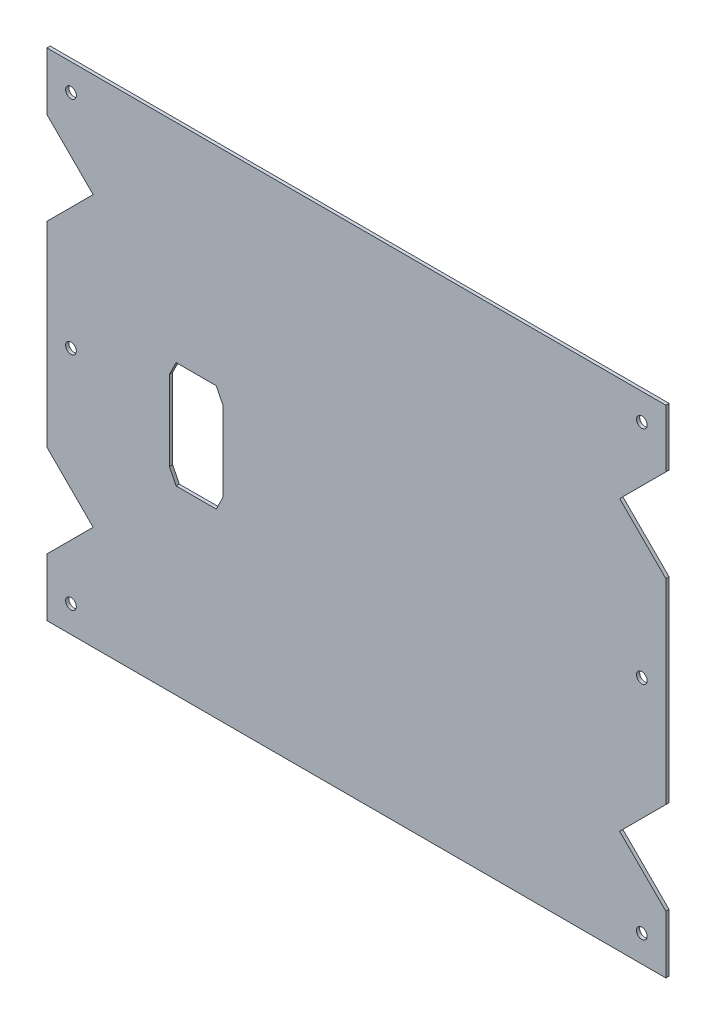
ISO-10303-21;
HEADER;
FILE_DESCRIPTION(('STEP AP214'),'2;1');
FILE_NAME('part.step','',(''),(''),'','','');
FILE_SCHEMA(('AUTOMOTIVE_DESIGN { 1 0 10303 214 1 1 1 1 }'));
ENDSEC;
DATA;
#1=APPLICATION_CONTEXT('core data for automotive mechanical design processes');
#2=APPLICATION_PROTOCOL_DEFINITION('international standard','automotive_design',2000,#1);
#3=PRODUCT_CONTEXT('',#1,'mechanical');
#4=PRODUCT('Part','Part','',(#3));
#5=PRODUCT_RELATED_PRODUCT_CATEGORY('part','',(#4));
#6=PRODUCT_DEFINITION_FORMATION('','',#4);
#7=PRODUCT_DEFINITION_CONTEXT('part definition',#1,'design');
#8=PRODUCT_DEFINITION('design','',#6,#7);
#9=PRODUCT_DEFINITION_SHAPE('','',#8);
#10=(LENGTH_UNIT() NAMED_UNIT(*) SI_UNIT(.MILLI.,.METRE.));
#11=(NAMED_UNIT(*) PLANE_ANGLE_UNIT() SI_UNIT($,.RADIAN.));
#12=(NAMED_UNIT(*) SI_UNIT($,.STERADIAN.) SOLID_ANGLE_UNIT());
#13=UNCERTAINTY_MEASURE_WITH_UNIT(LENGTH_MEASURE(1.E-05),#10,'distance_accuracy_value','');
#14=(GEOMETRIC_REPRESENTATION_CONTEXT(3) GLOBAL_UNCERTAINTY_ASSIGNED_CONTEXT((#13)) GLOBAL_UNIT_ASSIGNED_CONTEXT((#10,
#11,#12)) REPRESENTATION_CONTEXT('',''));
#15=CARTESIAN_POINT('',(0.,0.,0.));
#16=DIRECTION('',(0.,0.,1.));
#17=DIRECTION('',(1.,0.,0.));
#18=AXIS2_PLACEMENT_3D('',#15,#16,#17);
#19=CARTESIAN_POINT('',(0.,0.,-1.2));
#20=DIRECTION('',(0.,0.,-1.));
#21=DIRECTION('',(-1.,0.,0.));
#22=AXIS2_PLACEMENT_3D('',#19,#20,#21);
#23=PLANE('',#22);
#24=DIRECTION('',(0.707106781186546,0.707106781186549,0.));
#25=VECTOR('',#24,1.);
#26=CARTESIAN_POINT('',(-52.7102576685097,54.8232233047031,-1.19999999999962));
#27=LINE('',#26,#25);
#28=CARTESIAN_POINT('',(-15.8870343638064,91.6464466094066,-1.19999999999989));
#29=VERTEX_POINT('',#28);
#30=CARTESIAN_POINT('',(1.41003620869003,108.943517181903,-1.20000000000002));
#31=VERTEX_POINT('',#30);
#32=EDGE_CURVE('E859',#29,#31,#27,.T.);
#33=ORIENTED_EDGE('',*,*,#32,.T.);
#34=DIRECTION('',(-0.707106781186545,0.70710678118655,0.));
#35=VECTOR('',#34,1.);
#36=CARTESIAN_POINT('',(-52.7102576685094,163.063811059103,-1.19999999999937));
#37=LINE('',#36,#35);
#38=CARTESIAN_POINT('',(-15.8870343638065,126.2405877544,-1.19999999999977));
#39=VERTEX_POINT('',#38);
#40=EDGE_CURVE('E743',#31,#39,#37,.T.);
#41=ORIENTED_EDGE('',*,*,#40,.T.);
#42=DIRECTION('',(0.,1.,0.));
#43=VECTOR('',#42,1.);
#44=CARTESIAN_POINT('',(-15.8870343638065,109.823634363806,-1.19999999999981));
#45=LINE('',#44,#43);
#46=CARTESIAN_POINT('',(-15.8870343638064,147.887034363806,-1.19999999999967));
#47=VERTEX_POINT('',#46);
#48=EDGE_CURVE('E760',#47,#39,#45,.F.);
#49=ORIENTED_EDGE('',*,*,#48,.F.);
#50=DIRECTION('',(1.,0.,0.));
#51=VECTOR('',#50,1.);
#52=CARTESIAN_POINT('',(199.087034363806,147.887034363806,-1.19999999999978));
#53=LINE('',#52,#51);
#54=CARTESIAN_POINT('',(215.887034363806,147.887034363806,-1.19999999999967));
#55=VERTEX_POINT('',#54);
#56=EDGE_CURVE('E772',#55,#47,#53,.F.);
#57=ORIENTED_EDGE('',*,*,#56,.F.);
#58=DIRECTION('',(0.,-1.,0.));
#59=VECTOR('',#58,1.);
#60=CARTESIAN_POINT('',(215.887034363806,147.887034363806,-1.19999999999967));
#61=LINE('',#60,#59);
#62=CARTESIAN_POINT('',(215.887034363806,126.2405877544,-1.19999999999974));
#63=VERTEX_POINT('',#62);
#64=EDGE_CURVE('E770',#63,#55,#61,.F.);
#65=ORIENTED_EDGE('',*,*,#64,.F.);
#66=DIRECTION('',(-0.707106781186544,-0.707106781186551,0.));
#67=VECTOR('',#66,1.);
#68=CARTESIAN_POINT('',(252.710257668509,163.063811059103,-1.19999999999937));
#69=LINE('',#68,#67);
#70=CARTESIAN_POINT('',(198.58996379131,108.943517181903,-1.19999999999991));
#71=VERTEX_POINT('',#70);
#72=EDGE_CURVE('E749',#63,#71,#69,.T.);
#73=ORIENTED_EDGE('',*,*,#72,.T.);
#74=DIRECTION('',(0.707106781186546,-0.707106781186549,0.));
#75=VECTOR('',#74,1.);
#76=CARTESIAN_POINT('',(252.710257668509,54.8232233047035,-1.19999999999962));
#77=LINE('',#76,#75);
#78=CARTESIAN_POINT('',(215.887034363806,91.6464466094066,-1.1999999999999));
#79=VERTEX_POINT('',#78);
#80=EDGE_CURVE('E725',#71,#79,#77,.T.);
#81=ORIENTED_EDGE('',*,*,#80,.T.);
#82=DIRECTION('',(0.,-1.,0.));
#83=VECTOR('',#82,1.);
#84=CARTESIAN_POINT('',(215.887034363806,108.0634,-1.19999999999992));
#85=LINE('',#84,#83);
#86=CARTESIAN_POINT('',(215.887034363806,18.3535533905934,-1.19999999999987));
#87=VERTEX_POINT('',#86);
#88=EDGE_CURVE('E781',#87,#79,#85,.F.);
#89=ORIENTED_EDGE('',*,*,#88,.F.);
#90=DIRECTION('',(-0.707106781186546,-0.707106781186549,0.));
#91=VECTOR('',#90,1.);
#92=CARTESIAN_POINT('',(197.710257668509,0.176776695296352,-1.19999999999998));
#93=LINE('',#92,#91);
#94=CARTESIAN_POINT('',(198.58996379131,1.05648281809682,-1.19999999999997));
#95=VERTEX_POINT('',#94);
#96=EDGE_CURVE('E720',#87,#95,#93,.T.);
#97=ORIENTED_EDGE('',*,*,#96,.T.);
#98=DIRECTION('',(0.707106781186546,-0.707106781186549,0.));
#99=VECTOR('',#98,1.);
#100=CARTESIAN_POINT('',(197.710257668509,1.93618894089735,-1.20000000000003));
#101=LINE('',#100,#99);
#102=CARTESIAN_POINT('',(215.887034363806,-16.2405877543997,-1.1999999999998));
#103=VERTEX_POINT('',#102);
#104=EDGE_CURVE('E794',#95,#103,#101,.T.);
#105=ORIENTED_EDGE('',*,*,#104,.T.);
#106=DIRECTION('',(0.,-1.,0.));
#107=VECTOR('',#106,1.);
#108=CARTESIAN_POINT('',(215.887034363806,0.176365636193668,-1.19999999999991));
#109=LINE('',#108,#107);
#110=CARTESIAN_POINT('',(215.887034363806,-37.8870343638063,-1.19999999999964));
#111=VERTEX_POINT('',#110);
#112=EDGE_CURVE('E803',#111,#103,#109,.F.);
#113=ORIENTED_EDGE('',*,*,#112,.F.);
#114=DIRECTION('',(-1.,0.,0.));
#115=VECTOR('',#114,1.);
#116=CARTESIAN_POINT('',(215.887034363806,-37.8870343638063,-1.19999999999964));
#117=LINE('',#116,#115);
#118=CARTESIAN_POINT('',(-15.8870343638064,-37.8870343638064,-1.19999999999967));
#119=VERTEX_POINT('',#118);
#120=EDGE_CURVE('E822',#119,#111,#117,.F.);
#121=ORIENTED_EDGE('',*,*,#120,.F.);
#122=DIRECTION('',(0.,1.,0.));
#123=VECTOR('',#122,1.);
#124=CARTESIAN_POINT('',(-15.8870343638064,-37.8870343638064,-1.19999999999967));
#125=LINE('',#124,#123);
#126=CARTESIAN_POINT('',(-15.8870343638064,-16.2405877543997,-1.1999999999998));
#127=VERTEX_POINT('',#126);
#128=EDGE_CURVE('E816',#127,#119,#125,.F.);
#129=ORIENTED_EDGE('',*,*,#128,.F.);
#130=DIRECTION('',(0.707106781186547,0.707106781186548,0.));
#131=VECTOR('',#130,1.);
#132=CARTESIAN_POINT('',(2.28974233149026,1.93618894089697,-1.20000000000004));
#133=LINE('',#132,#131);
#134=CARTESIAN_POINT('',(1.41003620869012,1.05648281809682,-1.20000000000003));
#135=VERTEX_POINT('',#134);
#136=EDGE_CURVE('E789',#127,#135,#133,.T.);
#137=ORIENTED_EDGE('',*,*,#136,.T.);
#138=DIRECTION('',(-0.707106781186546,0.707106781186549,0.));
#139=VECTOR('',#138,1.);
#140=CARTESIAN_POINT('',(2.28974233149028,0.176776695296656,-1.19999999999999));
#141=LINE('',#140,#139);
#142=CARTESIAN_POINT('',(-15.8870343638064,18.3535533905934,-1.19999999999988));
#143=VERTEX_POINT('',#142);
#144=EDGE_CURVE('E861',#135,#143,#141,.T.);
#145=ORIENTED_EDGE('',*,*,#144,.T.);
#146=DIRECTION('',(0.,1.,0.));
#147=VECTOR('',#146,1.);
#148=CARTESIAN_POINT('',(-15.8870343638064,1.93659999999999,-1.19999999999987));
#149=LINE('',#148,#147);
#150=EDGE_CURVE('E828',#29,#143,#149,.F.);
#151=ORIENTED_EDGE('',*,*,#150,.F.);
#152=EDGE_LOOP('',(#33,#41,#49,#57,#65,#73,#81,#89,#97,#105,#113,#121,#129,#137,#145,#151));
#153=FACE_BOUND('',#152,.T.);
#154=DIRECTION('',(0.447213595499958,-0.894427190999916,0.));
#155=VECTOR('',#154,1.);
#156=CARTESIAN_POINT('',(66.,33.,-1.2));
#157=LINE('',#156,#155);
#158=CARTESIAN_POINT('',(47.5,70.,-1.2));
#159=VERTEX_POINT('',#158);
#160=CARTESIAN_POINT('',(50.,65.,-1.2));
#161=VERTEX_POINT('',#160);
#162=EDGE_CURVE('E13',#159,#161,#157,.T.);
#163=ORIENTED_EDGE('',*,*,#162,.F.);
#164=DIRECTION('',(1.,0.,0.));
#165=VECTOR('',#164,1.);
#166=CARTESIAN_POINT('',(0.,70.,-1.2));
#167=LINE('',#166,#165);
#168=CARTESIAN_POINT('',(32.5,70.,-1.2));
#169=VERTEX_POINT('',#168);
#170=EDGE_CURVE('E893',#169,#159,#167,.T.);
#171=ORIENTED_EDGE('',*,*,#170,.F.);
#172=DIRECTION('',(0.447213595499957,0.894427190999917,0.));
#173=VECTOR('',#172,1.);
#174=CARTESIAN_POINT('',(-1.99999999999995,0.999999999999971,-1.2));
#175=LINE('',#174,#173);
#176=CARTESIAN_POINT('',(30.,65.,-1.2));
#177=VERTEX_POINT('',#176);
#178=EDGE_CURVE('E907',#177,#169,#175,.T.);
#179=ORIENTED_EDGE('',*,*,#178,.F.);
#180=DIRECTION('',(0.,1.,0.));
#181=VECTOR('',#180,1.);
#182=CARTESIAN_POINT('',(30.,0.,-1.2));
#183=LINE('',#182,#181);
#184=CARTESIAN_POINT('',(30.,35.,-1.2));
#185=VERTEX_POINT('',#184);
#186=EDGE_CURVE('E909',#185,#177,#183,.T.);
#187=ORIENTED_EDGE('',*,*,#186,.F.);
#188=DIRECTION('',(-0.447213595499958,0.894427190999916,0.));
#189=VECTOR('',#188,1.);
#190=CARTESIAN_POINT('',(38.,19.,-1.2));
#191=LINE('',#190,#189);
#192=CARTESIAN_POINT('',(32.5,30.,-1.2));
#193=VERTEX_POINT('',#192);
#194=EDGE_CURVE('E911',#193,#185,#191,.T.);
#195=ORIENTED_EDGE('',*,*,#194,.F.);
#196=DIRECTION('',(-1.,0.,0.));
#197=VECTOR('',#196,1.);
#198=CARTESIAN_POINT('',(0.,30.,-1.2));
#199=LINE('',#198,#197);
#200=CARTESIAN_POINT('',(47.5,30.,-1.2));
#201=VERTEX_POINT('',#200);
#202=EDGE_CURVE('E913',#201,#193,#199,.T.);
#203=ORIENTED_EDGE('',*,*,#202,.F.);
#204=DIRECTION('',(-0.447213595499958,-0.894427190999916,0.));
#205=VECTOR('',#204,1.);
#206=CARTESIAN_POINT('',(26.,-13.,-1.2));
#207=LINE('',#206,#205);
#208=CARTESIAN_POINT('',(50.,35.,-1.2));
#209=VERTEX_POINT('',#208);
#210=EDGE_CURVE('E915',#209,#201,#207,.T.);
#211=ORIENTED_EDGE('',*,*,#210,.F.);
#212=DIRECTION('',(0.,-1.,0.));
#213=VECTOR('',#212,1.);
#214=CARTESIAN_POINT('',(50.,0.,-1.2));
#215=LINE('',#214,#213);
#216=EDGE_CURVE('E547',#161,#209,#215,.T.);
#217=ORIENTED_EDGE('',*,*,#216,.F.);
#218=EDGE_LOOP('',(#163,#171,#179,#187,#195,#203,#211,#217));
#219=FACE_BOUND('',#218,.T.);
#220=CARTESIAN_POINT('',(-6.88703436380638,55.,-1.19999999999996));
#221=DIRECTION('',(0.,0.,-1.));
#222=DIRECTION('',(-1.,0.,0.));
#223=AXIS2_PLACEMENT_3D('',#220,#221,#222);
#224=CIRCLE('',#223,2.);
#225=CARTESIAN_POINT('',(-8.88703436380638,55.,-1.19999999999995));
#226=VERTEX_POINT('',#225);
#227=EDGE_CURVE('E864',#226,#226,#224,.F.);
#228=ORIENTED_EDGE('',*,*,#227,.T.);
#229=EDGE_LOOP('',(#228));
#230=FACE_BOUND('',#229,.T.);
#231=CARTESIAN_POINT('',(206.887034363806,55.,-1.19999999999992));
#232=DIRECTION('',(0.,0.,-1.));
#233=DIRECTION('',(-1.,0.,0.));
#234=AXIS2_PLACEMENT_3D('',#231,#232,#233);
#235=CIRCLE('',#234,2.);
#236=CARTESIAN_POINT('',(204.887034363806,55.,-1.19999999999994));
#237=VERTEX_POINT('',#236);
#238=EDGE_CURVE('E836',#237,#237,#235,.F.);
#239=ORIENTED_EDGE('',*,*,#238,.T.);
#240=EDGE_LOOP('',(#239));
#241=FACE_BOUND('',#240,.T.);
#242=CARTESIAN_POINT('',(-6.88703436380642,-27.8870343638064,-1.19999999999978));
#243=DIRECTION('',(0.,0.,-1.));
#244=DIRECTION('',(-1.,0.,0.));
#245=AXIS2_PLACEMENT_3D('',#242,#243,#244);
#246=CIRCLE('',#245,2.);
#247=CARTESIAN_POINT('',(-8.88703436380643,-27.8870343638064,-1.19999999999977));
#248=VERTEX_POINT('',#247);
#249=EDGE_CURVE('E791',#248,#248,#246,.F.);
#250=ORIENTED_EDGE('',*,*,#249,.T.);
#251=EDGE_LOOP('',(#250));
#252=FACE_BOUND('',#251,.T.);
#253=CARTESIAN_POINT('',(206.887034363806,-27.8870343638064,-1.19999999999976));
#254=DIRECTION('',(0.,0.,-1.));
#255=DIRECTION('',(-1.,0.,0.));
#256=AXIS2_PLACEMENT_3D('',#253,#254,#255);
#257=CIRCLE('',#256,2.);
#258=CARTESIAN_POINT('',(204.887034363806,-27.8870343638064,-1.19999999999977));
#259=VERTEX_POINT('',#258);
#260=EDGE_CURVE('E797',#259,#259,#257,.F.);
#261=ORIENTED_EDGE('',*,*,#260,.T.);
#262=EDGE_LOOP('',(#261));
#263=FACE_BOUND('',#262,.T.);
#264=CARTESIAN_POINT('',(-6.88703436380644,137.887034363806,-1.19999999999978));
#265=DIRECTION('',(0.,0.,-1.));
#266=DIRECTION('',(1.,0.,0.));
#267=AXIS2_PLACEMENT_3D('',#264,#265,#266);
#268=CIRCLE('',#267,2.);
#269=CARTESIAN_POINT('',(-4.88703436380644,137.887034363806,-1.1999999999998));
#270=VERTEX_POINT('',#269);
#271=EDGE_CURVE('E746',#270,#270,#268,.F.);
#272=ORIENTED_EDGE('',*,*,#271,.T.);
#273=EDGE_LOOP('',(#272));
#274=FACE_BOUND('',#273,.T.);
#275=CARTESIAN_POINT('',(206.887034363806,137.887034363806,-1.19999999999976));
#276=DIRECTION('',(0.,0.,-1.));
#277=DIRECTION('',(1.,0.,0.));
#278=AXIS2_PLACEMENT_3D('',#275,#276,#277);
#279=CIRCLE('',#278,2.);
#280=CARTESIAN_POINT('',(208.887034363806,137.887034363806,-1.19999999999974));
#281=VERTEX_POINT('',#280);
#282=EDGE_CURVE('E751',#281,#281,#279,.F.);
#283=ORIENTED_EDGE('',*,*,#282,.T.);
#284=EDGE_LOOP('',(#283));
#285=FACE_BOUND('',#284,.T.);
#286=ADVANCED_FACE('F539',(#153,#219,#230,#241,#252,#263,#274,#285),#23,.T.);
#287=CARTESIAN_POINT('',(0.,0.,0.));
#288=DIRECTION('',(0.,0.,-1.));
#289=DIRECTION('',(-1.,0.,0.));
#290=AXIS2_PLACEMENT_3D('',#287,#288,#289);
#291=PLANE('',#290);
#292=DIRECTION('',(-0.707106781186545,0.70710678118655,0.));
#293=VECTOR('',#292,1.);
#294=CARTESIAN_POINT('',(0.17636563619354,110.1771877544,0.));
#295=LINE('',#294,#293);
#296=CARTESIAN_POINT('',(1.41003620869004,108.943517181903,0.));
#297=VERTEX_POINT('',#296);
#298=CARTESIAN_POINT('',(-15.8870343638065,126.2405877544,2.63677968348475E-13));
#299=VERTEX_POINT('',#298);
#300=EDGE_CURVE('E709',#297,#299,#295,.T.);
#301=ORIENTED_EDGE('',*,*,#300,.F.);
#302=DIRECTION('',(0.707106781186546,0.707106781186549,0.));
#303=VECTOR('',#302,1.);
#304=CARTESIAN_POINT('',(-75.2318054658451,32.3016755073676,5.32157219339853E-13));
#305=LINE('',#304,#303);
#306=CARTESIAN_POINT('',(-15.8870343638064,91.6464466094066,1.08852103899871E-13));
#307=VERTEX_POINT('',#306);
#308=EDGE_CURVE('E844',#307,#297,#305,.T.);
#309=ORIENTED_EDGE('',*,*,#308,.F.);
#310=DIRECTION('',(0.,-1.,0.));
#311=VECTOR('',#310,1.);
#312=CARTESIAN_POINT('',(-15.8870343638064,0.,1.31981700798769E-13));
#313=LINE('',#312,#311);
#314=CARTESIAN_POINT('',(-15.8870343638064,18.3535533905934,1.28651534041364E-13));
#315=VERTEX_POINT('',#314);
#316=EDGE_CURVE('E849',#307,#315,#313,.T.);
#317=ORIENTED_EDGE('',*,*,#316,.T.);
#318=DIRECTION('',(-0.707106781186546,0.707106781186549,0.));
#319=VECTOR('',#318,1.);
#320=CARTESIAN_POINT('',(0.176365636193652,2.2901533905933,0.));
#321=LINE('',#320,#319);
#322=CARTESIAN_POINT('',(1.41003620869013,1.05648281809683,0.));
#323=VERTEX_POINT('',#322);
#324=EDGE_CURVE('E857',#323,#315,#321,.T.);
#325=ORIENTED_EDGE('',*,*,#324,.F.);
#326=DIRECTION('',(0.707106781186547,0.707106781186548,0.));
#327=VECTOR('',#326,1.);
#328=CARTESIAN_POINT('',(-28.8193698335697,-29.1729232241631,3.65762592959217E-13));
#329=LINE('',#328,#327);
#330=CARTESIAN_POINT('',(-15.8870343638064,-16.2405877543997,1.9795699455924E-13));
#331=VERTEX_POINT('',#330);
#332=EDGE_CURVE('E784',#331,#323,#329,.T.);
#333=ORIENTED_EDGE('',*,*,#332,.F.);
#334=DIRECTION('',(0.,-1.,0.));
#335=VECTOR('',#334,1.);
#336=CARTESIAN_POINT('',(-15.8870343638064,2.11296563619365,0.));
#337=LINE('',#336,#335);
#338=CARTESIAN_POINT('',(-15.8870343638064,-37.8870343638064,3.30443354406211E-13));
#339=VERTEX_POINT('',#338);
#340=EDGE_CURVE('E811',#331,#339,#337,.T.);
#341=ORIENTED_EDGE('',*,*,#340,.T.);
#342=DIRECTION('',(1.,0.,0.));
#343=VECTOR('',#342,1.);
#344=CARTESIAN_POINT('',(2.11296563619357,-37.8870343638064,2.07399447753438E-13));
#345=LINE('',#344,#343);
#346=CARTESIAN_POINT('',(215.887034363806,-37.8870343638063,3.68760480071351E-13));
#347=VERTEX_POINT('',#346);
#348=EDGE_CURVE('E809',#339,#347,#345,.T.);
#349=ORIENTED_EDGE('',*,*,#348,.T.);
#350=DIRECTION('',(0.,1.,0.));
#351=VECTOR('',#350,1.);
#352=CARTESIAN_POINT('',(215.887034363806,2.11296563619367,0.));
#353=LINE('',#352,#351);
#354=CARTESIAN_POINT('',(215.887034363806,-16.2405877543997,2.09915588835456E-13));
#355=VERTEX_POINT('',#354);
#356=EDGE_CURVE('E800',#347,#355,#353,.T.);
#357=ORIENTED_EDGE('',*,*,#356,.T.);
#358=DIRECTION('',(0.707106781186546,-0.707106781186549,0.));
#359=VECTOR('',#358,1.);
#360=CARTESIAN_POINT('',(199.823634363806,-0.177187754399635,0.));
#361=LINE('',#360,#359);
#362=CARTESIAN_POINT('',(198.58996379131,1.05648281809683,0.));
#363=VERTEX_POINT('',#362);
#364=EDGE_CURVE('E782',#363,#355,#361,.T.);
#365=ORIENTED_EDGE('',*,*,#364,.F.);
#366=DIRECTION('',(-0.707106781186546,-0.707106781186549,0.));
#367=VECTOR('',#366,1.);
#368=CARTESIAN_POINT('',(275.231805465845,77.6983244926324,5.55111512312578E-13));
#369=LINE('',#368,#367);
#370=CARTESIAN_POINT('',(215.887034363806,18.3535533905934,1.38777878078145E-13));
#371=VERTEX_POINT('',#370);
#372=EDGE_CURVE('E826',#371,#363,#369,.T.);
#373=ORIENTED_EDGE('',*,*,#372,.F.);
#374=DIRECTION('',(0.,1.,0.));
#375=VECTOR('',#374,1.);
#376=CARTESIAN_POINT('',(215.887034363806,0.,1.38777878078145E-13));
#377=LINE('',#376,#375);
#378=CARTESIAN_POINT('',(215.887034363806,91.6464466094066,1.11022302462516E-13));
#379=VERTEX_POINT('',#378);
#380=EDGE_CURVE('E716',#371,#379,#377,.T.);
#381=ORIENTED_EDGE('',*,*,#380,.T.);
#382=DIRECTION('',(0.707106781186546,-0.707106781186549,0.));
#383=VECTOR('',#382,1.);
#384=CARTESIAN_POINT('',(199.823634363806,107.709846609407,0.));
#385=LINE('',#384,#383);
#386=CARTESIAN_POINT('',(198.58996379131,108.943517181903,0.));
#387=VERTEX_POINT('',#386);
#388=EDGE_CURVE('E712',#387,#379,#385,.T.);
#389=ORIENTED_EDGE('',*,*,#388,.F.);
#390=DIRECTION('',(-0.707106781186544,-0.707106781186551,0.));
#391=VECTOR('',#390,1.);
#392=CARTESIAN_POINT('',(228.81936983357,139.172923224163,4.16333634234434E-13));
#393=LINE('',#392,#391);
#394=CARTESIAN_POINT('',(215.887034363806,126.2405877544,2.63677968348475E-13));
#395=VERTEX_POINT('',#394);
#396=EDGE_CURVE('E700',#395,#387,#393,.T.);
#397=ORIENTED_EDGE('',*,*,#396,.F.);
#398=DIRECTION('',(0.,1.,0.));
#399=VECTOR('',#398,1.);
#400=CARTESIAN_POINT('',(215.887034363806,107.887034363806,1.94289029309402E-13));
#401=LINE('',#400,#399);
#402=CARTESIAN_POINT('',(215.887034363806,147.887034363806,3.33066907387547E-13));
#403=VERTEX_POINT('',#402);
#404=EDGE_CURVE('E768',#395,#403,#401,.T.);
#405=ORIENTED_EDGE('',*,*,#404,.T.);
#406=DIRECTION('',(-1.,0.,0.));
#407=VECTOR('',#406,1.);
#408=CARTESIAN_POINT('',(307.887034363806,147.887034363807,9.71445146547012E-13));
#409=LINE('',#408,#407);
#410=CARTESIAN_POINT('',(-15.8870343638064,147.887034363806,3.19189119579733E-13));
#411=VERTEX_POINT('',#410);
#412=EDGE_CURVE('E766',#403,#411,#409,.T.);
#413=ORIENTED_EDGE('',*,*,#412,.T.);
#414=DIRECTION('',(0.,-1.,0.));
#415=VECTOR('',#414,1.);
#416=CARTESIAN_POINT('',(-15.8870343638065,107.887034363806,1.94289029309402E-13));
#417=LINE('',#416,#415);
#418=EDGE_CURVE('E754',#411,#299,#417,.T.);
#419=ORIENTED_EDGE('',*,*,#418,.T.);
#420=EDGE_LOOP('',(#301,#309,#317,#325,#333,#341,#349,#357,#365,#373,#381,#389,#397,#405,#413,#419));
#421=FACE_BOUND('',#420,.T.);
#422=DIRECTION('',(-1.,0.,0.));
#423=VECTOR('',#422,1.);
#424=CARTESIAN_POINT('',(32.5,70.,0.));
#425=LINE('',#424,#423);
#426=CARTESIAN_POINT('',(47.5,70.,0.));
#427=VERTEX_POINT('',#426);
#428=CARTESIAN_POINT('',(32.5,70.,0.));
#429=VERTEX_POINT('',#428);
#430=EDGE_CURVE('E870',#427,#429,#425,.T.);
#431=ORIENTED_EDGE('',*,*,#430,.F.);
#432=DIRECTION('',(-0.447213595499958,0.894427190999916,0.));
#433=VECTOR('',#432,1.);
#434=CARTESIAN_POINT('',(47.5,70.,0.));
#435=LINE('',#434,#433);
#436=CARTESIAN_POINT('',(50.,65.,0.));
#437=VERTEX_POINT('',#436);
#438=EDGE_CURVE('E562',#437,#427,#435,.T.);
#439=ORIENTED_EDGE('',*,*,#438,.F.);
#440=DIRECTION('',(0.,1.,0.));
#441=VECTOR('',#440,1.);
#442=CARTESIAN_POINT('',(50.,65.,0.));
#443=LINE('',#442,#441);
#444=CARTESIAN_POINT('',(50.,35.,0.));
#445=VERTEX_POINT('',#444);
#446=EDGE_CURVE('E887',#445,#437,#443,.T.);
#447=ORIENTED_EDGE('',*,*,#446,.F.);
#448=DIRECTION('',(0.447213595499958,0.894427190999916,0.));
#449=VECTOR('',#448,1.);
#450=CARTESIAN_POINT('',(47.5,30.,0.));
#451=LINE('',#450,#449);
#452=CARTESIAN_POINT('',(47.5,30.,0.));
#453=VERTEX_POINT('',#452);
#454=EDGE_CURVE('E884',#453,#445,#451,.T.);
#455=ORIENTED_EDGE('',*,*,#454,.F.);
#456=DIRECTION('',(1.,0.,0.));
#457=VECTOR('',#456,1.);
#458=CARTESIAN_POINT('',(32.5,30.,0.));
#459=LINE('',#458,#457);
#460=CARTESIAN_POINT('',(32.5,30.,0.));
#461=VERTEX_POINT('',#460);
#462=EDGE_CURVE('E881',#461,#453,#459,.T.);
#463=ORIENTED_EDGE('',*,*,#462,.F.);
#464=DIRECTION('',(0.447213595499958,-0.894427190999916,0.));
#465=VECTOR('',#464,1.);
#466=CARTESIAN_POINT('',(30.,35.,0.));
#467=LINE('',#466,#465);
#468=CARTESIAN_POINT('',(30.,35.,0.));
#469=VERTEX_POINT('',#468);
#470=EDGE_CURVE('E878',#469,#461,#467,.T.);
#471=ORIENTED_EDGE('',*,*,#470,.F.);
#472=DIRECTION('',(0.,-1.,0.));
#473=VECTOR('',#472,1.);
#474=CARTESIAN_POINT('',(30.,65.,0.));
#475=LINE('',#474,#473);
#476=CARTESIAN_POINT('',(30.,65.,0.));
#477=VERTEX_POINT('',#476);
#478=EDGE_CURVE('E875',#477,#469,#475,.T.);
#479=ORIENTED_EDGE('',*,*,#478,.F.);
#480=DIRECTION('',(-0.447213595499957,-0.894427190999916,0.));
#481=VECTOR('',#480,1.);
#482=CARTESIAN_POINT('',(30.,65.,0.));
#483=LINE('',#482,#481);
#484=EDGE_CURVE('E872',#429,#477,#483,.T.);
#485=ORIENTED_EDGE('',*,*,#484,.F.);
#486=EDGE_LOOP('',(#431,#439,#447,#455,#463,#471,#479,#485));
#487=FACE_BOUND('',#486,.T.);
#488=CARTESIAN_POINT('',(-6.88703436380638,55.,0.));
#489=DIRECTION('',(0.,0.,-1.));
#490=DIRECTION('',(-1.,0.,0.));
#491=AXIS2_PLACEMENT_3D('',#488,#489,#490);
#492=CIRCLE('',#491,2.);
#493=CARTESIAN_POINT('',(-8.88703436380638,55.,0.));
#494=VERTEX_POINT('',#493);
#495=EDGE_CURVE('E852',#494,#494,#492,.T.);
#496=ORIENTED_EDGE('',*,*,#495,.T.);
#497=EDGE_LOOP('',(#496));
#498=FACE_BOUND('',#497,.T.);
#499=CARTESIAN_POINT('',(206.887034363806,55.,1.11022302462516E-13));
#500=DIRECTION('',(0.,0.,1.));
#501=DIRECTION('',(1.,0.,0.));
#502=AXIS2_PLACEMENT_3D('',#499,#500,#501);
#503=CIRCLE('',#502,2.);
#504=CARTESIAN_POINT('',(208.887034363806,55.,1.18005265140202E-13));
#505=VERTEX_POINT('',#504);
#506=EDGE_CURVE('E839',#505,#505,#503,.T.);
#507=ORIENTED_EDGE('',*,*,#506,.F.);
#508=EDGE_LOOP('',(#507));
#509=FACE_BOUND('',#508,.T.);
#510=CARTESIAN_POINT('',(206.887034363806,-27.8870343638064,2.77009804678872E-13));
#511=DIRECTION('',(0.,0.,1.));
#512=DIRECTION('',(0.,1.,0.));
#513=AXIS2_PLACEMENT_3D('',#510,#511,#512);
#514=CIRCLE('',#513,2.);
#515=CARTESIAN_POINT('',(206.887034363806,-25.8870343638064,2.62667337707909E-13));
#516=VERTEX_POINT('',#515);
#517=EDGE_CURVE('E740',#516,#516,#514,.T.);
#518=ORIENTED_EDGE('',*,*,#517,.F.);
#519=EDGE_LOOP('',(#518));
#520=FACE_BOUND('',#519,.T.);
#521=CARTESIAN_POINT('',(-6.88703436380642,-27.8870343638064,1.39471507510157E-13));
#522=DIRECTION('',(0.,0.,-1.));
#523=DIRECTION('',(0.,1.,0.));
#524=AXIS2_PLACEMENT_3D('',#521,#522,#523);
#525=CIRCLE('',#524,2.);
#526=CARTESIAN_POINT('',(-6.88703436380641,-25.8870343638064,1.30133503458622E-13));
#527=VERTEX_POINT('',#526);
#528=EDGE_CURVE('E813',#527,#527,#525,.T.);
#529=ORIENTED_EDGE('',*,*,#528,.T.);
#530=EDGE_LOOP('',(#529));
#531=FACE_BOUND('',#530,.T.);
#532=CARTESIAN_POINT('',(-6.88703436380644,137.887034363806,1.11022302462516E-13));
#533=DIRECTION('',(0.,0.,-1.));
#534=DIRECTION('',(0.,1.,0.));
#535=AXIS2_PLACEMENT_3D('',#532,#533,#534);
#536=CIRCLE('',#535,2.);
#537=CARTESIAN_POINT('',(-6.88703436380645,139.887034363806,1.13295182392505E-13));
#538=VERTEX_POINT('',#537);
#539=EDGE_CURVE('E757',#538,#538,#536,.T.);
#540=ORIENTED_EDGE('',*,*,#539,.T.);
#541=EDGE_LOOP('',(#540));
#542=FACE_BOUND('',#541,.T.);
#543=CARTESIAN_POINT('',(206.887034363806,137.887034363806,3.05311331771918E-13));
#544=DIRECTION('',(0.,0.,1.));
#545=DIRECTION('',(0.,1.,0.));
#546=AXIS2_PLACEMENT_3D('',#543,#544,#545);
#547=CIRCLE('',#546,2.);
#548=CARTESIAN_POINT('',(206.887034363806,139.887034363806,3.12294294449604E-13));
#549=VERTEX_POINT('',#548);
#550=EDGE_CURVE('E737',#549,#549,#547,.T.);
#551=ORIENTED_EDGE('',*,*,#550,.F.);
#552=EDGE_LOOP('',(#551));
#553=FACE_BOUND('',#552,.T.);
#554=ADVANCED_FACE('F541',(#421,#487,#498,#509,#520,#531,#542,#553),#291,.F.);
#555=CARTESIAN_POINT('',(47.5,70.,-40.0000000000001));
#556=DIRECTION('',(0.894427190999916,0.447213595499958,0.));
#557=DIRECTION('',(-0.447213595499958,0.894427190999916,0.));
#558=AXIS2_PLACEMENT_3D('',#555,#556,#557);
#559=PLANE('',#558);
#560=ORIENTED_EDGE('',*,*,#162,.T.);
#561=DIRECTION('',(0.,0.,1.));
#562=VECTOR('',#561,1.);
#563=CARTESIAN_POINT('',(50.,65.,-40.0000000000001));
#564=LINE('',#563,#562);
#565=EDGE_CURVE('E891',#161,#437,#564,.T.);
#566=ORIENTED_EDGE('',*,*,#565,.T.);
#567=ORIENTED_EDGE('',*,*,#438,.T.);
#568=DIRECTION('',(0.,0.,1.));
#569=VECTOR('',#568,1.);
#570=CARTESIAN_POINT('',(47.5,70.,-40.0000000000001));
#571=LINE('',#570,#569);
#572=EDGE_CURVE('E890',#159,#427,#571,.T.);
#573=ORIENTED_EDGE('',*,*,#572,.F.);
#574=EDGE_LOOP('',(#560,#566,#567,#573));
#575=FACE_BOUND('',#574,.T.);
#576=ADVANCED_FACE('F947',(#575),#559,.F.);
#577=CARTESIAN_POINT('',(50.,65.,-40.0000000000001));
#578=DIRECTION('',(1.,0.,0.));
#579=DIRECTION('',(0.,1.,0.));
#580=AXIS2_PLACEMENT_3D('',#577,#578,#579);
#581=PLANE('',#580);
#582=ORIENTED_EDGE('',*,*,#216,.T.);
#583=DIRECTION('',(0.,0.,1.));
#584=VECTOR('',#583,1.);
#585=CARTESIAN_POINT('',(50.,35.,-40.0000000000001));
#586=LINE('',#585,#584);
#587=EDGE_CURVE('E894',#209,#445,#586,.T.);
#588=ORIENTED_EDGE('',*,*,#587,.T.);
#589=ORIENTED_EDGE('',*,*,#446,.T.);
#590=ORIENTED_EDGE('',*,*,#565,.F.);
#591=EDGE_LOOP('',(#582,#588,#589,#590));
#592=FACE_BOUND('',#591,.T.);
#593=ADVANCED_FACE('F920',(#592),#581,.F.);
#594=CARTESIAN_POINT('',(47.5,30.,-40.0000000000001));
#595=DIRECTION('',(0.894427190999916,-0.447213595499958,0.));
#596=DIRECTION('',(0.447213595499958,0.894427190999916,0.));
#597=AXIS2_PLACEMENT_3D('',#594,#595,#596);
#598=PLANE('',#597);
#599=ORIENTED_EDGE('',*,*,#210,.T.);
#600=DIRECTION('',(0.,0.,1.));
#601=VECTOR('',#600,1.);
#602=CARTESIAN_POINT('',(47.5,30.,-40.0000000000001));
#603=LINE('',#602,#601);
#604=EDGE_CURVE('E896',#201,#453,#603,.T.);
#605=ORIENTED_EDGE('',*,*,#604,.T.);
#606=ORIENTED_EDGE('',*,*,#454,.T.);
#607=ORIENTED_EDGE('',*,*,#587,.F.);
#608=EDGE_LOOP('',(#599,#605,#606,#607));
#609=FACE_BOUND('',#608,.T.);
#610=ADVANCED_FACE('F925',(#609),#598,.F.);
#611=CARTESIAN_POINT('',(32.5,30.,-40.0000000000001));
#612=DIRECTION('',(0.,-1.,0.));
#613=DIRECTION('',(0.,0.,-1.));
#614=AXIS2_PLACEMENT_3D('',#611,#612,#613);
#615=PLANE('',#614);
#616=ORIENTED_EDGE('',*,*,#202,.T.);
#617=DIRECTION('',(0.,0.,1.));
#618=VECTOR('',#617,1.);
#619=CARTESIAN_POINT('',(32.5,30.,-40.0000000000001));
#620=LINE('',#619,#618);
#621=EDGE_CURVE('E898',#193,#461,#620,.T.);
#622=ORIENTED_EDGE('',*,*,#621,.T.);
#623=ORIENTED_EDGE('',*,*,#462,.T.);
#624=ORIENTED_EDGE('',*,*,#604,.F.);
#625=EDGE_LOOP('',(#616,#622,#623,#624));
#626=FACE_BOUND('',#625,.T.);
#627=ADVANCED_FACE('F935',(#626),#615,.F.);
#628=CARTESIAN_POINT('',(30.,35.,-40.0000000000001));
#629=DIRECTION('',(-0.894427190999916,-0.447213595499958,0.));
#630=DIRECTION('',(0.447213595499958,-0.894427190999916,0.));
#631=AXIS2_PLACEMENT_3D('',#628,#629,#630);
#632=PLANE('',#631);
#633=ORIENTED_EDGE('',*,*,#194,.T.);
#634=DIRECTION('',(0.,0.,1.));
#635=VECTOR('',#634,1.);
#636=CARTESIAN_POINT('',(30.,35.,-40.0000000000001));
#637=LINE('',#636,#635);
#638=EDGE_CURVE('E900',#185,#469,#637,.T.);
#639=ORIENTED_EDGE('',*,*,#638,.T.);
#640=ORIENTED_EDGE('',*,*,#470,.T.);
#641=ORIENTED_EDGE('',*,*,#621,.F.);
#642=EDGE_LOOP('',(#633,#639,#640,#641));
#643=FACE_BOUND('',#642,.T.);
#644=ADVANCED_FACE('F937',(#643),#632,.F.);
#645=CARTESIAN_POINT('',(30.,65.,-40.0000000000001));
#646=DIRECTION('',(-1.,0.,0.));
#647=DIRECTION('',(0.,-1.,0.));
#648=AXIS2_PLACEMENT_3D('',#645,#646,#647);
#649=PLANE('',#648);
#650=ORIENTED_EDGE('',*,*,#186,.T.);
#651=DIRECTION('',(0.,0.,1.));
#652=VECTOR('',#651,1.);
#653=CARTESIAN_POINT('',(30.,65.,-40.0000000000001));
#654=LINE('',#653,#652);
#655=EDGE_CURVE('E902',#177,#477,#654,.T.);
#656=ORIENTED_EDGE('',*,*,#655,.T.);
#657=ORIENTED_EDGE('',*,*,#478,.T.);
#658=ORIENTED_EDGE('',*,*,#638,.F.);
#659=EDGE_LOOP('',(#650,#656,#657,#658));
#660=FACE_BOUND('',#659,.T.);
#661=ADVANCED_FACE('F953',(#660),#649,.F.);
#662=CARTESIAN_POINT('',(30.,65.,-40.0000000000001));
#663=DIRECTION('',(-0.894427190999916,0.447213595499957,0.));
#664=DIRECTION('',(-0.447213595499957,-0.894427190999917,0.));
#665=AXIS2_PLACEMENT_3D('',#662,#663,#664);
#666=PLANE('',#665);
#667=ORIENTED_EDGE('',*,*,#178,.T.);
#668=DIRECTION('',(0.,0.,1.));
#669=VECTOR('',#668,1.);
#670=CARTESIAN_POINT('',(32.5,70.,-40.0000000000001));
#671=LINE('',#670,#669);
#672=EDGE_CURVE('E554',#169,#429,#671,.T.);
#673=ORIENTED_EDGE('',*,*,#672,.T.);
#674=ORIENTED_EDGE('',*,*,#484,.T.);
#675=ORIENTED_EDGE('',*,*,#655,.F.);
#676=EDGE_LOOP('',(#667,#673,#674,#675));
#677=FACE_BOUND('',#676,.T.);
#678=ADVANCED_FACE('F951',(#677),#666,.F.);
#679=CARTESIAN_POINT('',(32.5,70.,-40.0000000000001));
#680=DIRECTION('',(0.,1.,0.));
#681=DIRECTION('',(0.,0.,1.));
#682=AXIS2_PLACEMENT_3D('',#679,#680,#681);
#683=PLANE('',#682);
#684=ORIENTED_EDGE('',*,*,#170,.T.);
#685=ORIENTED_EDGE('',*,*,#572,.T.);
#686=ORIENTED_EDGE('',*,*,#430,.T.);
#687=ORIENTED_EDGE('',*,*,#672,.F.);
#688=EDGE_LOOP('',(#684,#685,#686,#687));
#689=FACE_BOUND('',#688,.T.);
#690=ADVANCED_FACE('F945',(#689),#683,.F.);
#691=CARTESIAN_POINT('',(-15.8870343638064,1.93659999999999,1.31380458177387E-13));
#692=DIRECTION('',(1.,0.,0.));
#693=DIRECTION('',(0.,0.,-1.));
#694=AXIS2_PLACEMENT_3D('',#691,#692,#693);
#695=PLANE('',#694);
#696=DIRECTION('',(0.,0.,-1.));
#697=VECTOR('',#696,1.);
#698=CARTESIAN_POINT('',(-15.8870343638064,18.3535533905934,1.27237171358524E-13));
#699=LINE('',#698,#697);
#700=EDGE_CURVE('E855',#315,#143,#699,.T.);
#701=ORIENTED_EDGE('',*,*,#700,.F.);
#702=ORIENTED_EDGE('',*,*,#316,.F.);
#703=DIRECTION('',(0.,0.,1.));
#704=VECTOR('',#703,1.);
#705=CARTESIAN_POINT('',(-15.8870343638064,91.6464466094066,1.08739617569776E-13));
#706=LINE('',#705,#704);
#707=EDGE_CURVE('E846',#29,#307,#706,.T.);
#708=ORIENTED_EDGE('',*,*,#707,.F.);
#709=ORIENTED_EDGE('',*,*,#150,.T.);
#710=EDGE_LOOP('',(#701,#702,#708,#709));
#711=FACE_BOUND('',#710,.T.);
#712=ADVANCED_FACE('F971',(#711),#695,.F.);
#713=CARTESIAN_POINT('',(-6.88703436380708,54.9999999999999,-200.));
#714=DIRECTION('',(0.,0.,1.));
#715=DIRECTION('',(1.,0.,0.));
#716=AXIS2_PLACEMENT_3D('',#713,#714,#715);
#717=CYLINDRICAL_SURFACE('',#716,2.);
#718=ORIENTED_EDGE('',*,*,#227,.F.);
#719=EDGE_LOOP('',(#718));
#720=FACE_BOUND('',#719,.T.);
#721=ORIENTED_EDGE('',*,*,#495,.F.);
#722=EDGE_LOOP('',(#721));
#723=FACE_BOUND('',#722,.T.);
#724=ADVANCED_FACE('F975',(#720,#723),#717,.F.);
#725=CARTESIAN_POINT('',(0.176365636193652,2.2901533905933,0.));
#726=DIRECTION('',(-0.707106781186549,-0.707106781186546,0.));
#727=DIRECTION('',(-0.707106781186546,0.707106781186549,0.));
#728=AXIS2_PLACEMENT_3D('',#725,#726,#727);
#729=PLANE('',#728);
#730=ORIENTED_EDGE('',*,*,#144,.F.);
#731=DIRECTION('',(0.,0.,-1.));
#732=VECTOR('',#731,1.);
#733=CARTESIAN_POINT('',(1.41003620869013,1.05648281809683,0.));
#734=LINE('',#733,#732);
#735=EDGE_CURVE('E734',#323,#135,#734,.T.);
#736=ORIENTED_EDGE('',*,*,#735,.F.);
#737=ORIENTED_EDGE('',*,*,#324,.T.);
#738=ORIENTED_EDGE('',*,*,#700,.T.);
#739=EDGE_LOOP('',(#730,#736,#737,#738));
#740=FACE_BOUND('',#739,.T.);
#741=ADVANCED_FACE('F981',(#740),#729,.T.);
#742=CARTESIAN_POINT('',(-75.2318054658451,32.3016755073676,5.32157219339853E-13));
#743=DIRECTION('',(-0.707106781186549,0.707106781186546,0.));
#744=DIRECTION('',(0.707106781186546,0.707106781186549,0.));
#745=AXIS2_PLACEMENT_3D('',#742,#743,#744);
#746=PLANE('',#745);
#747=ORIENTED_EDGE('',*,*,#32,.F.);
#748=ORIENTED_EDGE('',*,*,#707,.T.);
#749=ORIENTED_EDGE('',*,*,#308,.T.);
#750=DIRECTION('',(0.,0.,-1.));
#751=VECTOR('',#750,1.);
#752=CARTESIAN_POINT('',(1.41003620869004,108.943517181903,0.));
#753=LINE('',#752,#751);
#754=EDGE_CURVE('E726',#297,#31,#753,.T.);
#755=ORIENTED_EDGE('',*,*,#754,.T.);
#756=EDGE_LOOP('',(#747,#748,#749,#755));
#757=FACE_BOUND('',#756,.T.);
#758=ADVANCED_FACE('F991',(#757),#746,.T.);
#759=CARTESIAN_POINT('',(215.887034363806,108.0634,0.));
#760=DIRECTION('',(-1.,0.,0.));
#761=DIRECTION('',(0.,0.,1.));
#762=AXIS2_PLACEMENT_3D('',#759,#760,#761);
#763=PLANE('',#762);
#764=DIRECTION('',(0.,0.,-1.));
#765=VECTOR('',#764,1.);
#766=CARTESIAN_POINT('',(215.887034363806,91.6464466094066,1.11022302462516E-13));
#767=LINE('',#766,#765);
#768=EDGE_CURVE('E719',#379,#79,#767,.T.);
#769=ORIENTED_EDGE('',*,*,#768,.F.);
#770=ORIENTED_EDGE('',*,*,#380,.F.);
#771=DIRECTION('',(0.,0.,1.));
#772=VECTOR('',#771,1.);
#773=CARTESIAN_POINT('',(215.887034363806,18.3535533905934,1.11022302462516E-13));
#774=LINE('',#773,#772);
#775=EDGE_CURVE('E829',#87,#371,#774,.T.);
#776=ORIENTED_EDGE('',*,*,#775,.F.);
#777=ORIENTED_EDGE('',*,*,#88,.T.);
#778=EDGE_LOOP('',(#769,#770,#776,#777));
#779=FACE_BOUND('',#778,.T.);
#780=ADVANCED_FACE('F995',(#779),#763,.F.);
#781=CARTESIAN_POINT('',(206.887034363806,55.,1.11022302462516E-13));
#782=DIRECTION('',(0.,0.,-1.));
#783=DIRECTION('',(-1.,0.,0.));
#784=AXIS2_PLACEMENT_3D('',#781,#782,#783);
#785=CYLINDRICAL_SURFACE('',#784,2.);
#786=ORIENTED_EDGE('',*,*,#238,.F.);
#787=EDGE_LOOP('',(#786));
#788=FACE_BOUND('',#787,.T.);
#789=ORIENTED_EDGE('',*,*,#506,.T.);
#790=EDGE_LOOP('',(#789));
#791=FACE_BOUND('',#790,.T.);
#792=ADVANCED_FACE('F1065',(#788,#791),#785,.F.);
#793=CARTESIAN_POINT('',(199.823634363806,107.709846609407,0.));
#794=DIRECTION('',(0.707106781186549,0.707106781186546,0.));
#795=DIRECTION('',(-0.707106781186546,0.707106781186549,0.));
#796=AXIS2_PLACEMENT_3D('',#793,#794,#795);
#797=PLANE('',#796);
#798=ORIENTED_EDGE('',*,*,#80,.F.);
#799=DIRECTION('',(0.,0.,-1.));
#800=VECTOR('',#799,1.);
#801=CARTESIAN_POINT('',(198.58996379131,108.943517181903,0.));
#802=LINE('',#801,#800);
#803=EDGE_CURVE('E705',#387,#71,#802,.T.);
#804=ORIENTED_EDGE('',*,*,#803,.F.);
#805=ORIENTED_EDGE('',*,*,#388,.T.);
#806=ORIENTED_EDGE('',*,*,#768,.T.);
#807=EDGE_LOOP('',(#798,#804,#805,#806));
#808=FACE_BOUND('',#807,.T.);
#809=ADVANCED_FACE('F723',(#808),#797,.T.);
#810=CARTESIAN_POINT('',(275.231805465845,77.6983244926324,5.55111512312578E-13));
#811=DIRECTION('',(0.707106781186549,-0.707106781186546,0.));
#812=DIRECTION('',(0.707106781186546,0.707106781186549,0.));
#813=AXIS2_PLACEMENT_3D('',#810,#811,#812);
#814=PLANE('',#813);
#815=ORIENTED_EDGE('',*,*,#96,.F.);
#816=ORIENTED_EDGE('',*,*,#775,.T.);
#817=ORIENTED_EDGE('',*,*,#372,.T.);
#818=DIRECTION('',(0.,0.,-1.));
#819=VECTOR('',#818,1.);
#820=CARTESIAN_POINT('',(198.58996379131,1.05648281809683,0.));
#821=LINE('',#820,#819);
#822=EDGE_CURVE('E729',#363,#95,#821,.T.);
#823=ORIENTED_EDGE('',*,*,#822,.T.);
#824=EDGE_LOOP('',(#815,#816,#817,#823));
#825=FACE_BOUND('',#824,.T.);
#826=ADVANCED_FACE('F986',(#825),#814,.T.);
#827=CARTESIAN_POINT('',(206.887034363806,-27.8870343638064,2.77009804678872E-13));
#828=DIRECTION('',(0.,0.,-1.));
#829=DIRECTION('',(0.,1.,0.));
#830=AXIS2_PLACEMENT_3D('',#827,#828,#829);
#831=CYLINDRICAL_SURFACE('',#830,2.);
#832=ORIENTED_EDGE('',*,*,#260,.F.);
#833=EDGE_LOOP('',(#832));
#834=FACE_BOUND('',#833,.T.);
#835=ORIENTED_EDGE('',*,*,#517,.T.);
#836=EDGE_LOOP('',(#835));
#837=FACE_BOUND('',#836,.T.);
#838=ADVANCED_FACE('F1094',(#834,#837),#831,.F.);
#839=CARTESIAN_POINT('',(-6.88703436380709,-27.8870343638073,-200.));
#840=DIRECTION('',(0.,0.,1.));
#841=DIRECTION('',(0.,1.,0.));
#842=AXIS2_PLACEMENT_3D('',#839,#840,#841);
#843=CYLINDRICAL_SURFACE('',#842,2.);
#844=ORIENTED_EDGE('',*,*,#249,.F.);
#845=EDGE_LOOP('',(#844));
#846=FACE_BOUND('',#845,.T.);
#847=ORIENTED_EDGE('',*,*,#528,.F.);
#848=EDGE_LOOP('',(#847));
#849=FACE_BOUND('',#848,.T.);
#850=ADVANCED_FACE('F1104',(#846,#849),#843,.F.);
#851=CARTESIAN_POINT('',(215.887034363806,-37.8870343638063,3.68760480071351E-13));
#852=DIRECTION('',(0.,1.,0.));
#853=DIRECTION('',(-1.,0.,0.));
#854=AXIS2_PLACEMENT_3D('',#851,#852,#853);
#855=PLANE('',#854);
#856=DIRECTION('',(0.,0.,-1.));
#857=VECTOR('',#856,1.);
#858=CARTESIAN_POINT('',(215.887034363806,-37.8870343638063,3.68760480071351E-13));
#859=LINE('',#858,#857);
#860=EDGE_CURVE('E806',#347,#111,#859,.T.);
#861=ORIENTED_EDGE('',*,*,#860,.F.);
#862=ORIENTED_EDGE('',*,*,#348,.F.);
#863=DIRECTION('',(0.,0.,-1.));
#864=VECTOR('',#863,1.);
#865=CARTESIAN_POINT('',(-15.8870343638064,-37.8870343638064,3.30428186768451E-13));
#866=LINE('',#865,#864);
#867=EDGE_CURVE('E819',#339,#119,#866,.T.);
#868=ORIENTED_EDGE('',*,*,#867,.T.);
#869=ORIENTED_EDGE('',*,*,#120,.T.);
#870=EDGE_LOOP('',(#861,#862,#868,#869));
#871=FACE_BOUND('',#870,.T.);
#872=ADVANCED_FACE('F1115',(#871),#855,.F.);
#873=CARTESIAN_POINT('',(-15.8870343638064,-37.8870343638064,3.30535058024601E-13));
#874=DIRECTION('',(1.,0.,0.));
#875=DIRECTION('',(0.,0.,-1.));
#876=AXIS2_PLACEMENT_3D('',#873,#874,#875);
#877=PLANE('',#876);
#878=DIRECTION('',(0.,0.,1.));
#879=VECTOR('',#878,1.);
#880=CARTESIAN_POINT('',(-15.8870343638064,-16.2405877543997,1.97147880734357E-13));
#881=LINE('',#880,#879);
#882=EDGE_CURVE('E786',#127,#331,#881,.T.);
#883=ORIENTED_EDGE('',*,*,#882,.F.);
#884=ORIENTED_EDGE('',*,*,#128,.T.);
#885=ORIENTED_EDGE('',*,*,#867,.F.);
#886=ORIENTED_EDGE('',*,*,#340,.F.);
#887=EDGE_LOOP('',(#883,#884,#885,#886));
#888=FACE_BOUND('',#887,.T.);
#889=ADVANCED_FACE('F1127',(#888),#877,.F.);
#890=CARTESIAN_POINT('',(215.887034363806,0.176365636193677,0.));
#891=DIRECTION('',(-1.,0.,0.));
#892=DIRECTION('',(0.,0.,1.));
#893=AXIS2_PLACEMENT_3D('',#890,#891,#892);
#894=PLANE('',#893);
#895=DIRECTION('',(0.,0.,-1.));
#896=VECTOR('',#895,1.);
#897=CARTESIAN_POINT('',(215.887034363806,-16.2405877543997,2.09915588835456E-13));
#898=LINE('',#897,#896);
#899=EDGE_CURVE('E779',#355,#103,#898,.T.);
#900=ORIENTED_EDGE('',*,*,#899,.F.);
#901=ORIENTED_EDGE('',*,*,#356,.F.);
#902=ORIENTED_EDGE('',*,*,#860,.T.);
#903=ORIENTED_EDGE('',*,*,#112,.T.);
#904=EDGE_LOOP('',(#900,#901,#902,#903));
#905=FACE_BOUND('',#904,.T.);
#906=ADVANCED_FACE('F1141',(#905),#894,.F.);
#907=CARTESIAN_POINT('',(-28.8193698335697,-29.1729232241631,3.65762592959217E-13));
#908=DIRECTION('',(-0.707106781186548,0.707106781186547,0.));
#909=DIRECTION('',(0.707106781186547,0.707106781186548,0.));
#910=AXIS2_PLACEMENT_3D('',#907,#908,#909);
#911=PLANE('',#910);
#912=ORIENTED_EDGE('',*,*,#136,.F.);
#913=ORIENTED_EDGE('',*,*,#882,.T.);
#914=ORIENTED_EDGE('',*,*,#332,.T.);
#915=ORIENTED_EDGE('',*,*,#735,.T.);
#916=EDGE_LOOP('',(#912,#913,#914,#915));
#917=FACE_BOUND('',#916,.T.);
#918=ADVANCED_FACE('F1152',(#917),#911,.T.);
#919=CARTESIAN_POINT('',(199.823634363806,-0.177187754399635,0.));
#920=DIRECTION('',(0.707106781186549,0.707106781186546,0.));
#921=DIRECTION('',(-0.707106781186546,0.707106781186549,0.));
#922=AXIS2_PLACEMENT_3D('',#919,#920,#921);
#923=PLANE('',#922);
#924=ORIENTED_EDGE('',*,*,#104,.F.);
#925=ORIENTED_EDGE('',*,*,#822,.F.);
#926=ORIENTED_EDGE('',*,*,#364,.T.);
#927=ORIENTED_EDGE('',*,*,#899,.T.);
#928=EDGE_LOOP('',(#924,#925,#926,#927));
#929=FACE_BOUND('',#928,.T.);
#930=ADVANCED_FACE('F1163',(#929),#923,.T.);
#931=CARTESIAN_POINT('',(206.887034363806,137.887034363806,3.05311331771918E-13));
#932=DIRECTION('',(0.,0.,-1.));
#933=DIRECTION('',(0.,-1.,0.));
#934=AXIS2_PLACEMENT_3D('',#931,#932,#933);
#935=CYLINDRICAL_SURFACE('',#934,2.);
#936=ORIENTED_EDGE('',*,*,#282,.F.);
#937=EDGE_LOOP('',(#936));
#938=FACE_BOUND('',#937,.T.);
#939=ORIENTED_EDGE('',*,*,#550,.T.);
#940=EDGE_LOOP('',(#939));
#941=FACE_BOUND('',#940,.T.);
#942=ADVANCED_FACE('F1174',(#938,#941),#935,.F.);
#943=CARTESIAN_POINT('',(199.087034363806,147.887034363806,2.22044604925031E-13));
#944=DIRECTION('',(0.,-1.,0.));
#945=DIRECTION('',(1.,0.,0.));
#946=AXIS2_PLACEMENT_3D('',#943,#944,#945);
#947=PLANE('',#946);
#948=ORIENTED_EDGE('',*,*,#56,.T.);
#949=DIRECTION('',(0.,0.,-1.));
#950=VECTOR('',#949,1.);
#951=CARTESIAN_POINT('',(-15.8870343638064,147.887034363806,3.19189119579733E-13));
#952=LINE('',#951,#950);
#953=EDGE_CURVE('E763',#411,#47,#952,.T.);
#954=ORIENTED_EDGE('',*,*,#953,.F.);
#955=ORIENTED_EDGE('',*,*,#412,.F.);
#956=DIRECTION('',(0.,0.,-1.));
#957=VECTOR('',#956,1.);
#958=CARTESIAN_POINT('',(215.887034363806,147.887034363806,3.33066907387547E-13));
#959=LINE('',#958,#957);
#960=EDGE_CURVE('E774',#403,#55,#959,.T.);
#961=ORIENTED_EDGE('',*,*,#960,.T.);
#962=EDGE_LOOP('',(#948,#954,#955,#961));
#963=FACE_BOUND('',#962,.T.);
#964=ADVANCED_FACE('F1185',(#963),#947,.F.);
#965=CARTESIAN_POINT('',(-6.88703436380714,137.887034363807,-200.));
#966=DIRECTION('',(0.,0.,1.));
#967=DIRECTION('',(0.,-1.,0.));
#968=AXIS2_PLACEMENT_3D('',#965,#966,#967);
#969=CYLINDRICAL_SURFACE('',#968,2.);
#970=ORIENTED_EDGE('',*,*,#271,.F.);
#971=EDGE_LOOP('',(#970));
#972=FACE_BOUND('',#971,.T.);
#973=ORIENTED_EDGE('',*,*,#539,.F.);
#974=EDGE_LOOP('',(#973));
#975=FACE_BOUND('',#974,.T.);
#976=ADVANCED_FACE('F1197',(#972,#975),#969,.F.);
#977=CARTESIAN_POINT('',(215.887034363806,147.887034363806,3.33066907387547E-13));
#978=DIRECTION('',(-1.,0.,0.));
#979=DIRECTION('',(0.,-1.,0.));
#980=AXIS2_PLACEMENT_3D('',#977,#978,#979);
#981=PLANE('',#980);
#982=DIRECTION('',(0.,0.,1.));
#983=VECTOR('',#982,1.);
#984=CARTESIAN_POINT('',(215.887034363806,126.2405877544,2.63677968348475E-13));
#985=LINE('',#984,#983);
#986=EDGE_CURVE('E706',#63,#395,#985,.T.);
#987=ORIENTED_EDGE('',*,*,#986,.F.);
#988=ORIENTED_EDGE('',*,*,#64,.T.);
#989=ORIENTED_EDGE('',*,*,#960,.F.);
#990=ORIENTED_EDGE('',*,*,#404,.F.);
#991=EDGE_LOOP('',(#987,#988,#989,#990));
#992=FACE_BOUND('',#991,.T.);
#993=ADVANCED_FACE('F1211',(#992),#981,.F.);
#994=CARTESIAN_POINT('',(-15.8870343638065,109.823634363806,1.94289029309402E-13));
#995=DIRECTION('',(1.,0.,0.));
#996=DIRECTION('',(0.,-1.,0.));
#997=AXIS2_PLACEMENT_3D('',#994,#995,#996);
#998=PLANE('',#997);
#999=DIRECTION('',(0.,0.,-1.));
#1000=VECTOR('',#999,1.);
#1001=CARTESIAN_POINT('',(-15.8870343638065,126.2405877544,2.63677968348475E-13));
#1002=LINE('',#1001,#1000);
#1003=EDGE_CURVE('E738',#299,#39,#1002,.T.);
#1004=ORIENTED_EDGE('',*,*,#1003,.F.);
#1005=ORIENTED_EDGE('',*,*,#418,.F.);
#1006=ORIENTED_EDGE('',*,*,#953,.T.);
#1007=ORIENTED_EDGE('',*,*,#48,.T.);
#1008=EDGE_LOOP('',(#1004,#1005,#1006,#1007));
#1009=FACE_BOUND('',#1008,.T.);
#1010=ADVANCED_FACE('F1222',(#1009),#998,.F.);
#1011=CARTESIAN_POINT('',(228.81936983357,139.172923224163,4.16333634234434E-13));
#1012=DIRECTION('',(0.707106781186551,-0.707106781186544,0.));
#1013=DIRECTION('',(0.707106781186544,0.707106781186551,0.));
#1014=AXIS2_PLACEMENT_3D('',#1011,#1012,#1013);
#1015=PLANE('',#1014);
#1016=ORIENTED_EDGE('',*,*,#72,.F.);
#1017=ORIENTED_EDGE('',*,*,#986,.T.);
#1018=ORIENTED_EDGE('',*,*,#396,.T.);
#1019=ORIENTED_EDGE('',*,*,#803,.T.);
#1020=EDGE_LOOP('',(#1016,#1017,#1018,#1019));
#1021=FACE_BOUND('',#1020,.T.);
#1022=ADVANCED_FACE('F703',(#1021),#1015,.T.);
#1023=CARTESIAN_POINT('',(0.17636563619354,110.1771877544,0.));
#1024=DIRECTION('',(-0.70710678118655,-0.707106781186545,0.));
#1025=DIRECTION('',(-0.707106781186545,0.70710678118655,0.));
#1026=AXIS2_PLACEMENT_3D('',#1023,#1024,#1025);
#1027=PLANE('',#1026);
#1028=ORIENTED_EDGE('',*,*,#40,.F.);
#1029=ORIENTED_EDGE('',*,*,#754,.F.);
#1030=ORIENTED_EDGE('',*,*,#300,.T.);
#1031=ORIENTED_EDGE('',*,*,#1003,.T.);
#1032=EDGE_LOOP('',(#1028,#1029,#1030,#1031));
#1033=FACE_BOUND('',#1032,.T.);
#1034=ADVANCED_FACE('F1243',(#1033),#1027,.T.);
#1035=CLOSED_SHELL('',(#286,#554,#576,#593,#610,#627,#644,#661,#678,#690,#712,#724,#741,#758,
#780,#792,#809,#826,#838,#850,#872,#889,#906,#918,#930,#942,#964,#976,#993,#1010,#1022,#1034));
#1036=MANIFOLD_SOLID_BREP('B2',#1035);
#1037=ADVANCED_BREP_SHAPE_REPRESENTATION('',(#18,#1036),#14);
#1038=SHAPE_DEFINITION_REPRESENTATION(#9,#1037);
ENDSEC;
END-ISO-10303-21;
